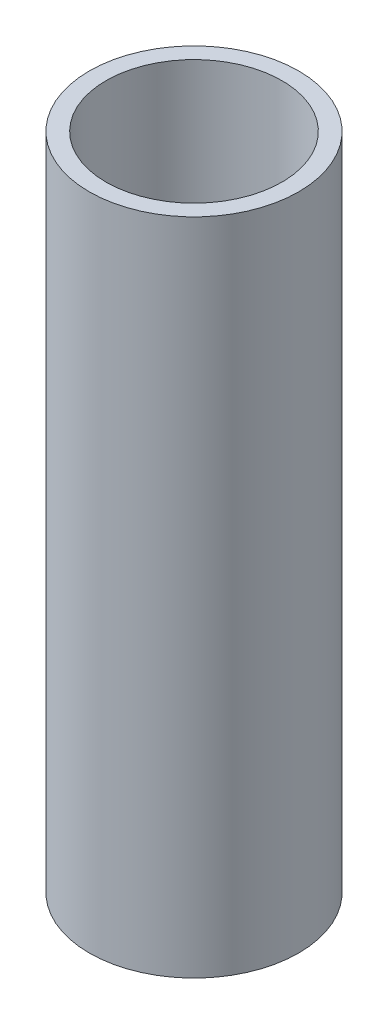
ISO-10303-21;
HEADER;
FILE_DESCRIPTION(('STEP AP214'),'2;1');
FILE_NAME('part.step','',(''),(''),'','','');
FILE_SCHEMA(('AUTOMOTIVE_DESIGN { 1 0 10303 214 1 1 1 1 }'));
ENDSEC;
DATA;
#1=APPLICATION_CONTEXT('core data for automotive mechanical design processes');
#2=APPLICATION_PROTOCOL_DEFINITION('international standard','automotive_design',2000,#1);
#3=PRODUCT_CONTEXT('',#1,'mechanical');
#4=PRODUCT('Part','Part','',(#3));
#5=PRODUCT_RELATED_PRODUCT_CATEGORY('part','',(#4));
#6=PRODUCT_DEFINITION_FORMATION('','',#4);
#7=PRODUCT_DEFINITION_CONTEXT('part definition',#1,'design');
#8=PRODUCT_DEFINITION('design','',#6,#7);
#9=PRODUCT_DEFINITION_SHAPE('','',#8);
#10=(LENGTH_UNIT() NAMED_UNIT(*) SI_UNIT(.MILLI.,.METRE.));
#11=(NAMED_UNIT(*) PLANE_ANGLE_UNIT() SI_UNIT($,.RADIAN.));
#12=(NAMED_UNIT(*) SI_UNIT($,.STERADIAN.) SOLID_ANGLE_UNIT());
#13=UNCERTAINTY_MEASURE_WITH_UNIT(LENGTH_MEASURE(1.E-05),#10,'distance_accuracy_value','');
#14=(GEOMETRIC_REPRESENTATION_CONTEXT(3) GLOBAL_UNCERTAINTY_ASSIGNED_CONTEXT((#13)) GLOBAL_UNIT_ASSIGNED_CONTEXT((#10,
#11,#12)) REPRESENTATION_CONTEXT('',''));
#15=CARTESIAN_POINT('',(0.,0.,0.));
#16=DIRECTION('',(0.,0.,1.));
#17=DIRECTION('',(1.,0.,0.));
#18=AXIS2_PLACEMENT_3D('',#15,#16,#17);
#19=CARTESIAN_POINT('',(0.,19.9898,0.));
#20=DIRECTION('',(0.,1.,0.));
#21=DIRECTION('',(0.,0.,1.));
#22=AXIS2_PLACEMENT_3D('',#19,#20,#21);
#23=PLANE('',#22);
#24=CARTESIAN_POINT('',(0.,19.9898,0.));
#25=DIRECTION('',(0.,1.,0.));
#26=DIRECTION('',(0.,0.,1.));
#27=AXIS2_PLACEMENT_3D('',#24,#25,#26);
#28=CIRCLE('',#27,3.175);
#29=CARTESIAN_POINT('',(0.,19.9898,3.175));
#30=VERTEX_POINT('',#29);
#31=EDGE_CURVE('E10',#30,#30,#28,.T.);
#32=ORIENTED_EDGE('',*,*,#31,.T.);
#33=EDGE_LOOP('',(#32));
#34=FACE_BOUND('',#33,.T.);
#35=CARTESIAN_POINT('',(0.,19.9898,0.));
#36=DIRECTION('',(0.,1.,0.));
#37=DIRECTION('',(0.,0.,1.));
#38=AXIS2_PLACEMENT_3D('',#35,#36,#37);
#39=CIRCLE('',#38,2.667);
#40=CARTESIAN_POINT('',(0.,19.9898,2.667));
#41=VERTEX_POINT('',#40);
#42=EDGE_CURVE('E44',#41,#41,#39,.T.);
#43=ORIENTED_EDGE('',*,*,#42,.F.);
#44=EDGE_LOOP('',(#43));
#45=FACE_BOUND('',#44,.T.);
#46=ADVANCED_FACE('F33',(#34,#45),#23,.T.);
#47=CARTESIAN_POINT('',(0.,0.,0.));
#48=DIRECTION('',(0.,1.,0.));
#49=DIRECTION('',(0.,0.,1.));
#50=AXIS2_PLACEMENT_3D('',#47,#48,#49);
#51=PLANE('',#50);
#52=CARTESIAN_POINT('',(0.,0.,0.));
#53=DIRECTION('',(0.,1.,0.));
#54=DIRECTION('',(0.,0.,1.));
#55=AXIS2_PLACEMENT_3D('',#52,#53,#54);
#56=CIRCLE('',#55,3.175);
#57=CARTESIAN_POINT('',(0.,0.,3.175));
#58=VERTEX_POINT('',#57);
#59=EDGE_CURVE('E37',#58,#58,#56,.T.);
#60=ORIENTED_EDGE('',*,*,#59,.F.);
#61=EDGE_LOOP('',(#60));
#62=FACE_BOUND('',#61,.T.);
#63=CARTESIAN_POINT('',(0.,0.,0.));
#64=DIRECTION('',(0.,1.,0.));
#65=DIRECTION('',(0.,0.,1.));
#66=AXIS2_PLACEMENT_3D('',#63,#64,#65);
#67=CIRCLE('',#66,2.667);
#68=CARTESIAN_POINT('',(0.,0.,2.667));
#69=VERTEX_POINT('',#68);
#70=EDGE_CURVE('E46',#69,#69,#67,.T.);
#71=ORIENTED_EDGE('',*,*,#70,.T.);
#72=EDGE_LOOP('',(#71));
#73=FACE_BOUND('',#72,.T.);
#74=ADVANCED_FACE('F56',(#62,#73),#51,.F.);
#75=CARTESIAN_POINT('',(0.,19.9898,0.));
#76=DIRECTION('',(0.,-1.,0.));
#77=DIRECTION('',(0.,0.,-1.));
#78=AXIS2_PLACEMENT_3D('',#75,#76,#77);
#79=CYLINDRICAL_SURFACE('',#78,3.175);
#80=ORIENTED_EDGE('',*,*,#31,.F.);
#81=EDGE_LOOP('',(#80));
#82=FACE_BOUND('',#81,.T.);
#83=ORIENTED_EDGE('',*,*,#59,.T.);
#84=EDGE_LOOP('',(#83));
#85=FACE_BOUND('',#84,.T.);
#86=ADVANCED_FACE('F35',(#82,#85),#79,.T.);
#87=CARTESIAN_POINT('',(0.,19.9898,0.));
#88=DIRECTION('',(0.,-1.,0.));
#89=DIRECTION('',(0.,0.,-1.));
#90=AXIS2_PLACEMENT_3D('',#87,#88,#89);
#91=CYLINDRICAL_SURFACE('',#90,2.667);
#92=ORIENTED_EDGE('',*,*,#42,.T.);
#93=EDGE_LOOP('',(#92));
#94=FACE_BOUND('',#93,.T.);
#95=ORIENTED_EDGE('',*,*,#70,.F.);
#96=EDGE_LOOP('',(#95));
#97=FACE_BOUND('',#96,.T.);
#98=ADVANCED_FACE('F52',(#94,#97),#91,.F.);
#99=CLOSED_SHELL('',(#46,#74,#86,#98));
#100=MANIFOLD_SOLID_BREP('B2',#99);
#101=ADVANCED_BREP_SHAPE_REPRESENTATION('',(#18,#100),#14);
#102=SHAPE_DEFINITION_REPRESENTATION(#9,#101);
ENDSEC;
END-ISO-10303-21;
